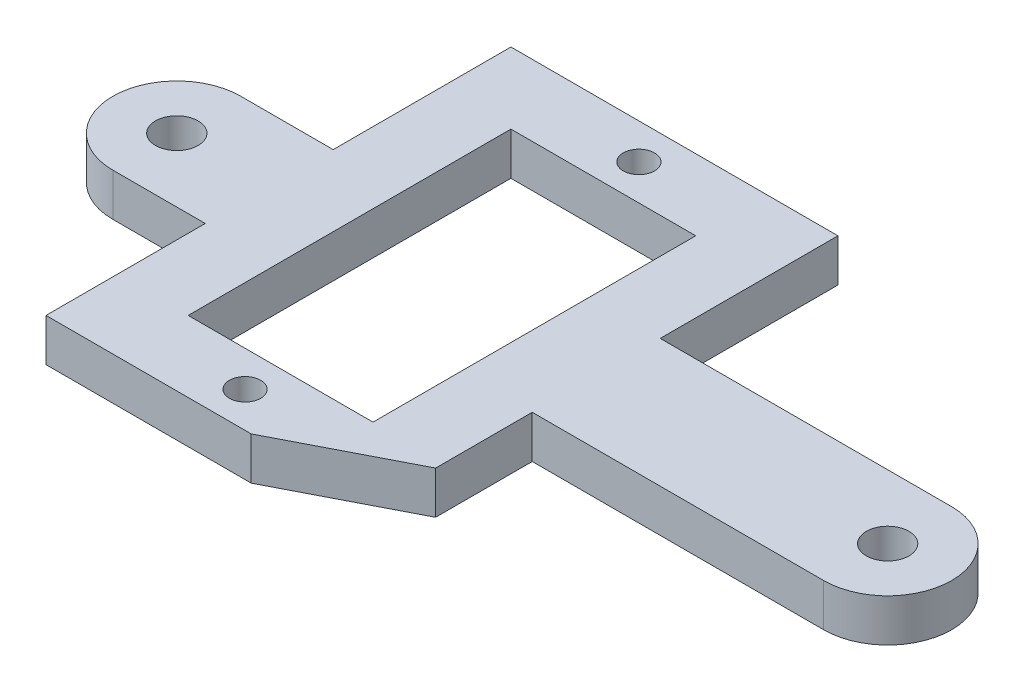
ISO-10303-21;
HEADER;
FILE_DESCRIPTION(('STEP AP214'),'2;1');
FILE_NAME('part.step','',(''),(''),'','','');
FILE_SCHEMA(('AUTOMOTIVE_DESIGN { 1 0 10303 214 1 1 1 1 }'));
ENDSEC;
DATA;
#1=APPLICATION_CONTEXT('core data for automotive mechanical design processes');
#2=APPLICATION_PROTOCOL_DEFINITION('international standard','automotive_design',2000,#1);
#3=PRODUCT_CONTEXT('',#1,'mechanical');
#4=PRODUCT('Part','Part','',(#3));
#5=PRODUCT_RELATED_PRODUCT_CATEGORY('part','',(#4));
#6=PRODUCT_DEFINITION_FORMATION('','',#4);
#7=PRODUCT_DEFINITION_CONTEXT('part definition',#1,'design');
#8=PRODUCT_DEFINITION('design','',#6,#7);
#9=PRODUCT_DEFINITION_SHAPE('','',#8);
#10=(LENGTH_UNIT() NAMED_UNIT(*) SI_UNIT(.MILLI.,.METRE.));
#11=(NAMED_UNIT(*) PLANE_ANGLE_UNIT() SI_UNIT($,.RADIAN.));
#12=(NAMED_UNIT(*) SI_UNIT($,.STERADIAN.) SOLID_ANGLE_UNIT());
#13=UNCERTAINTY_MEASURE_WITH_UNIT(LENGTH_MEASURE(1.E-05),#10,'distance_accuracy_value','');
#14=(GEOMETRIC_REPRESENTATION_CONTEXT(3) GLOBAL_UNCERTAINTY_ASSIGNED_CONTEXT((#13)) GLOBAL_UNIT_ASSIGNED_CONTEXT((#10,
#11,#12)) REPRESENTATION_CONTEXT('',''));
#15=CARTESIAN_POINT('',(0.,0.,0.));
#16=DIRECTION('',(0.,0.,1.));
#17=DIRECTION('',(1.,0.,0.));
#18=AXIS2_PLACEMENT_3D('',#15,#16,#17);
#19=CARTESIAN_POINT('',(-25.,3.,0.));
#20=DIRECTION('',(0.,-1.,0.));
#21=DIRECTION('',(0.,0.,-1.));
#22=AXIS2_PLACEMENT_3D('',#19,#20,#21);
#23=CYLINDRICAL_SURFACE('',#22,4.5);
#24=CARTESIAN_POINT('',(-25.,0.,0.));
#25=DIRECTION('',(0.,1.,0.));
#26=DIRECTION('',(0.,0.,1.));
#27=AXIS2_PLACEMENT_3D('',#24,#25,#26);
#28=CIRCLE('',#27,4.5);
#29=CARTESIAN_POINT('',(-25.,0.,-4.5));
#30=VERTEX_POINT('',#29);
#31=CARTESIAN_POINT('',(-25.,0.,4.5));
#32=VERTEX_POINT('',#31);
#33=EDGE_CURVE('E223',#30,#32,#28,.T.);
#34=ORIENTED_EDGE('',*,*,#33,.T.);
#35=DIRECTION('',(0.,-1.,0.));
#36=VECTOR('',#35,1.);
#37=CARTESIAN_POINT('',(-25.,3.,4.5));
#38=LINE('',#37,#36);
#39=CARTESIAN_POINT('',(-25.,3.,4.5));
#40=VERTEX_POINT('',#39);
#41=EDGE_CURVE('E11',#40,#32,#38,.T.);
#42=ORIENTED_EDGE('',*,*,#41,.F.);
#43=CARTESIAN_POINT('',(-25.,3.,0.));
#44=DIRECTION('',(0.,1.,0.));
#45=DIRECTION('',(0.,0.,1.));
#46=AXIS2_PLACEMENT_3D('',#43,#44,#45);
#47=CIRCLE('',#46,4.5);
#48=CARTESIAN_POINT('',(-25.,3.,-4.5));
#49=VERTEX_POINT('',#48);
#50=EDGE_CURVE('E409',#49,#40,#47,.T.);
#51=ORIENTED_EDGE('',*,*,#50,.F.);
#52=DIRECTION('',(0.,-1.,0.));
#53=VECTOR('',#52,1.);
#54=CARTESIAN_POINT('',(-25.,3.,-4.5));
#55=LINE('',#54,#53);
#56=EDGE_CURVE('E69',#49,#30,#55,.T.);
#57=ORIENTED_EDGE('',*,*,#56,.T.);
#58=EDGE_LOOP('',(#34,#42,#51,#57));
#59=FACE_BOUND('',#58,.T.);
#60=ADVANCED_FACE('F43',(#59),#23,.T.);
#61=CARTESIAN_POINT('',(0.,3.,4.5));
#62=DIRECTION('',(0.,0.,1.));
#63=DIRECTION('',(1.,0.,0.));
#64=AXIS2_PLACEMENT_3D('',#61,#62,#63);
#65=PLANE('',#64);
#66=DIRECTION('',(-1.,0.,0.));
#67=VECTOR('',#66,1.);
#68=CARTESIAN_POINT('',(0.,0.,4.5));
#69=LINE('',#68,#67);
#70=CARTESIAN_POINT('',(-18.5,0.,4.5));
#71=VERTEX_POINT('',#70);
#72=EDGE_CURVE('E225',#71,#32,#69,.T.);
#73=ORIENTED_EDGE('',*,*,#72,.F.);
#74=DIRECTION('',(0.,-1.,0.));
#75=VECTOR('',#74,1.);
#76=CARTESIAN_POINT('',(-18.5,3.,4.5));
#77=LINE('',#76,#75);
#78=CARTESIAN_POINT('',(-18.5,3.,4.5));
#79=VERTEX_POINT('',#78);
#80=EDGE_CURVE('E52',#79,#71,#77,.T.);
#81=ORIENTED_EDGE('',*,*,#80,.F.);
#82=DIRECTION('',(-1.,0.,0.));
#83=VECTOR('',#82,1.);
#84=CARTESIAN_POINT('',(0.,3.,4.5));
#85=LINE('',#84,#83);
#86=EDGE_CURVE('E396',#79,#40,#85,.T.);
#87=ORIENTED_EDGE('',*,*,#86,.T.);
#88=ORIENTED_EDGE('',*,*,#41,.T.);
#89=EDGE_LOOP('',(#73,#81,#87,#88));
#90=FACE_BOUND('',#89,.T.);
#91=ADVANCED_FACE('F315',(#90),#65,.T.);
#92=CARTESIAN_POINT('',(-18.5,3.,0.));
#93=DIRECTION('',(-1.,0.,0.));
#94=DIRECTION('',(0.,0.,1.));
#95=AXIS2_PLACEMENT_3D('',#92,#93,#94);
#96=PLANE('',#95);
#97=DIRECTION('',(0.,0.,-1.));
#98=VECTOR('',#97,1.);
#99=CARTESIAN_POINT('',(-18.5,0.,0.));
#100=LINE('',#99,#98);
#101=CARTESIAN_POINT('',(-18.5,0.,15.7));
#102=VERTEX_POINT('',#101);
#103=EDGE_CURVE('E228',#102,#71,#100,.T.);
#104=ORIENTED_EDGE('',*,*,#103,.F.);
#105=DIRECTION('',(0.,-1.,0.));
#106=VECTOR('',#105,1.);
#107=CARTESIAN_POINT('',(-18.5,3.,15.7));
#108=LINE('',#107,#106);
#109=CARTESIAN_POINT('',(-18.5,3.,15.7));
#110=VERTEX_POINT('',#109);
#111=EDGE_CURVE('E275',#110,#102,#108,.T.);
#112=ORIENTED_EDGE('',*,*,#111,.F.);
#113=DIRECTION('',(0.,0.,-1.));
#114=VECTOR('',#113,1.);
#115=CARTESIAN_POINT('',(-18.5,3.,0.));
#116=LINE('',#115,#114);
#117=EDGE_CURVE('E392',#110,#79,#116,.T.);
#118=ORIENTED_EDGE('',*,*,#117,.T.);
#119=ORIENTED_EDGE('',*,*,#80,.T.);
#120=EDGE_LOOP('',(#104,#112,#118,#119));
#121=FACE_BOUND('',#120,.T.);
#122=ADVANCED_FACE('F320',(#121),#96,.T.);
#123=CARTESIAN_POINT('',(0.,3.,15.7));
#124=DIRECTION('',(0.,0.,1.));
#125=DIRECTION('',(1.,0.,0.));
#126=AXIS2_PLACEMENT_3D('',#123,#124,#125);
#127=PLANE('',#126);
#128=DIRECTION('',(0.,1.,0.));
#129=VECTOR('',#128,1.);
#130=CARTESIAN_POINT('',(-4.06496436339705,0.,15.7));
#131=LINE('',#130,#129);
#132=CARTESIAN_POINT('',(-4.06496436339704,0.,15.7));
#133=VERTEX_POINT('',#132);
#134=CARTESIAN_POINT('',(-4.06496436339705,3.,15.7));
#135=VERTEX_POINT('',#134);
#136=EDGE_CURVE('E60',#133,#135,#131,.T.);
#137=ORIENTED_EDGE('',*,*,#136,.T.);
#138=DIRECTION('',(-1.,0.,0.));
#139=VECTOR('',#138,1.);
#140=CARTESIAN_POINT('',(0.,3.,15.7));
#141=LINE('',#140,#139);
#142=EDGE_CURVE('E390',#135,#110,#141,.T.);
#143=ORIENTED_EDGE('',*,*,#142,.T.);
#144=ORIENTED_EDGE('',*,*,#111,.T.);
#145=DIRECTION('',(-1.,0.,0.));
#146=VECTOR('',#145,1.);
#147=CARTESIAN_POINT('',(0.,0.,15.7));
#148=LINE('',#147,#146);
#149=EDGE_CURVE('E231',#133,#102,#148,.T.);
#150=ORIENTED_EDGE('',*,*,#149,.F.);
#151=EDGE_LOOP('',(#137,#143,#144,#150));
#152=FACE_BOUND('',#151,.T.);
#153=ADVANCED_FACE('F371',(#152),#127,.T.);
#154=CARTESIAN_POINT('',(4.49999999999999,3.,0.));
#155=DIRECTION('',(-1.,0.,0.));
#156=DIRECTION('',(0.,0.,1.));
#157=AXIS2_PLACEMENT_3D('',#154,#155,#156);
#158=PLANE('',#157);
#159=DIRECTION('',(0.,0.,-1.));
#160=VECTOR('',#159,1.);
#161=CARTESIAN_POINT('',(4.49999999999999,3.,0.));
#162=LINE('',#161,#160);
#163=CARTESIAN_POINT('',(4.5,3.,11.2960154737872));
#164=VERTEX_POINT('',#163);
#165=CARTESIAN_POINT('',(4.5,3.,4.5));
#166=VERTEX_POINT('',#165);
#167=EDGE_CURVE('E391',#164,#166,#162,.T.);
#168=ORIENTED_EDGE('',*,*,#167,.F.);
#169=DIRECTION('',(0.,1.,0.));
#170=VECTOR('',#169,1.);
#171=CARTESIAN_POINT('',(4.5,0.,11.2960154737872));
#172=LINE('',#171,#170);
#173=CARTESIAN_POINT('',(4.5,0.,11.2960154737872));
#174=VERTEX_POINT('',#173);
#175=EDGE_CURVE('E422',#174,#164,#172,.T.);
#176=ORIENTED_EDGE('',*,*,#175,.F.);
#177=DIRECTION('',(0.,0.,-1.));
#178=VECTOR('',#177,1.);
#179=CARTESIAN_POINT('',(4.49999999999999,0.,0.));
#180=LINE('',#179,#178);
#181=CARTESIAN_POINT('',(4.5,0.,4.5));
#182=VERTEX_POINT('',#181);
#183=EDGE_CURVE('E233',#174,#182,#180,.T.);
#184=ORIENTED_EDGE('',*,*,#183,.T.);
#185=DIRECTION('',(0.,-1.,0.));
#186=VECTOR('',#185,1.);
#187=CARTESIAN_POINT('',(4.5,3.,4.5));
#188=LINE('',#187,#186);
#189=EDGE_CURVE('E272',#166,#182,#188,.T.);
#190=ORIENTED_EDGE('',*,*,#189,.F.);
#191=EDGE_LOOP('',(#168,#176,#184,#190));
#192=FACE_BOUND('',#191,.T.);
#193=ADVANCED_FACE('F367',(#192),#158,.F.);
#194=CARTESIAN_POINT('',(0.,3.,4.5));
#195=DIRECTION('',(0.,0.,1.));
#196=DIRECTION('',(1.,0.,0.));
#197=AXIS2_PLACEMENT_3D('',#194,#195,#196);
#198=PLANE('',#197);
#199=DIRECTION('',(-1.,0.,0.));
#200=VECTOR('',#199,1.);
#201=CARTESIAN_POINT('',(0.,0.,4.5));
#202=LINE('',#201,#200);
#203=CARTESIAN_POINT('',(25.,0.,4.5));
#204=VERTEX_POINT('',#203);
#205=EDGE_CURVE('E235',#204,#182,#202,.T.);
#206=ORIENTED_EDGE('',*,*,#205,.F.);
#207=DIRECTION('',(0.,-1.,0.));
#208=VECTOR('',#207,1.);
#209=CARTESIAN_POINT('',(25.,3.,4.5));
#210=LINE('',#209,#208);
#211=CARTESIAN_POINT('',(25.,3.,4.5));
#212=VERTEX_POINT('',#211);
#213=EDGE_CURVE('E270',#212,#204,#210,.T.);
#214=ORIENTED_EDGE('',*,*,#213,.F.);
#215=DIRECTION('',(-1.,0.,0.));
#216=VECTOR('',#215,1.);
#217=CARTESIAN_POINT('',(0.,3.,4.5));
#218=LINE('',#217,#216);
#219=EDGE_CURVE('E394',#212,#166,#218,.T.);
#220=ORIENTED_EDGE('',*,*,#219,.T.);
#221=ORIENTED_EDGE('',*,*,#189,.T.);
#222=EDGE_LOOP('',(#206,#214,#220,#221));
#223=FACE_BOUND('',#222,.T.);
#224=ADVANCED_FACE('F363',(#223),#198,.T.);
#225=CARTESIAN_POINT('',(25.,3.,0.));
#226=DIRECTION('',(0.,-1.,0.));
#227=DIRECTION('',(0.,0.,-1.));
#228=AXIS2_PLACEMENT_3D('',#225,#226,#227);
#229=CYLINDRICAL_SURFACE('',#228,4.5);
#230=CARTESIAN_POINT('',(25.,0.,0.));
#231=DIRECTION('',(0.,1.,0.));
#232=DIRECTION('',(0.,0.,1.));
#233=AXIS2_PLACEMENT_3D('',#230,#231,#232);
#234=CIRCLE('',#233,4.5);
#235=CARTESIAN_POINT('',(25.,0.,-4.5));
#236=VERTEX_POINT('',#235);
#237=EDGE_CURVE('E238',#204,#236,#234,.T.);
#238=ORIENTED_EDGE('',*,*,#237,.T.);
#239=DIRECTION('',(0.,-1.,0.));
#240=VECTOR('',#239,1.);
#241=CARTESIAN_POINT('',(25.,3.,-4.5));
#242=LINE('',#241,#240);
#243=CARTESIAN_POINT('',(25.,3.,-4.5));
#244=VERTEX_POINT('',#243);
#245=EDGE_CURVE('E268',#244,#236,#242,.T.);
#246=ORIENTED_EDGE('',*,*,#245,.F.);
#247=CARTESIAN_POINT('',(25.,3.,0.));
#248=DIRECTION('',(0.,1.,0.));
#249=DIRECTION('',(0.,0.,1.));
#250=AXIS2_PLACEMENT_3D('',#247,#248,#249);
#251=CIRCLE('',#250,4.5);
#252=EDGE_CURVE('E402',#212,#244,#251,.T.);
#253=ORIENTED_EDGE('',*,*,#252,.F.);
#254=ORIENTED_EDGE('',*,*,#213,.T.);
#255=EDGE_LOOP('',(#238,#246,#253,#254));
#256=FACE_BOUND('',#255,.T.);
#257=ADVANCED_FACE('F359',(#256),#229,.T.);
#258=CARTESIAN_POINT('',(0.,3.,-4.5));
#259=DIRECTION('',(0.,0.,-1.));
#260=DIRECTION('',(-1.,0.,0.));
#261=AXIS2_PLACEMENT_3D('',#258,#259,#260);
#262=PLANE('',#261);
#263=DIRECTION('',(1.,0.,0.));
#264=VECTOR('',#263,1.);
#265=CARTESIAN_POINT('',(0.,0.,-4.5));
#266=LINE('',#265,#264);
#267=CARTESIAN_POINT('',(4.49999999999999,0.,-4.5));
#268=VERTEX_POINT('',#267);
#269=EDGE_CURVE('E241',#268,#236,#266,.T.);
#270=ORIENTED_EDGE('',*,*,#269,.F.);
#271=DIRECTION('',(0.,-1.,0.));
#272=VECTOR('',#271,1.);
#273=CARTESIAN_POINT('',(4.49999999999999,3.,-4.5));
#274=LINE('',#273,#272);
#275=CARTESIAN_POINT('',(4.49999999999999,3.,-4.5));
#276=VERTEX_POINT('',#275);
#277=EDGE_CURVE('E266',#276,#268,#274,.T.);
#278=ORIENTED_EDGE('',*,*,#277,.F.);
#279=DIRECTION('',(1.,0.,0.));
#280=VECTOR('',#279,1.);
#281=CARTESIAN_POINT('',(0.,3.,-4.5));
#282=LINE('',#281,#280);
#283=EDGE_CURVE('E404',#276,#244,#282,.T.);
#284=ORIENTED_EDGE('',*,*,#283,.T.);
#285=ORIENTED_EDGE('',*,*,#245,.T.);
#286=EDGE_LOOP('',(#270,#278,#284,#285));
#287=FACE_BOUND('',#286,.T.);
#288=ADVANCED_FACE('F355',(#287),#262,.T.);
#289=CARTESIAN_POINT('',(4.49999999999999,3.,0.));
#290=DIRECTION('',(1.,0.,0.));
#291=DIRECTION('',(0.,0.,-1.));
#292=AXIS2_PLACEMENT_3D('',#289,#290,#291);
#293=PLANE('',#292);
#294=DIRECTION('',(0.,0.,1.));
#295=VECTOR('',#294,1.);
#296=CARTESIAN_POINT('',(4.49999999999999,0.,0.));
#297=LINE('',#296,#295);
#298=CARTESIAN_POINT('',(4.49999999999999,0.,-17.));
#299=VERTEX_POINT('',#298);
#300=EDGE_CURVE('E244',#299,#268,#297,.T.);
#301=ORIENTED_EDGE('',*,*,#300,.F.);
#302=DIRECTION('',(0.,-1.,0.));
#303=VECTOR('',#302,1.);
#304=CARTESIAN_POINT('',(4.49999999999999,3.,-17.));
#305=LINE('',#304,#303);
#306=CARTESIAN_POINT('',(4.49999999999999,3.,-17.));
#307=VERTEX_POINT('',#306);
#308=EDGE_CURVE('E190',#307,#299,#305,.T.);
#309=ORIENTED_EDGE('',*,*,#308,.F.);
#310=DIRECTION('',(0.,0.,1.));
#311=VECTOR('',#310,1.);
#312=CARTESIAN_POINT('',(4.49999999999999,3.,0.));
#313=LINE('',#312,#311);
#314=EDGE_CURVE('E179',#307,#276,#313,.T.);
#315=ORIENTED_EDGE('',*,*,#314,.T.);
#316=ORIENTED_EDGE('',*,*,#277,.T.);
#317=EDGE_LOOP('',(#301,#309,#315,#316));
#318=FACE_BOUND('',#317,.T.);
#319=ADVANCED_FACE('F352',(#318),#293,.T.);
#320=CARTESIAN_POINT('',(0.,3.,-17.));
#321=DIRECTION('',(0.,0.,1.));
#322=DIRECTION('',(1.,0.,0.));
#323=AXIS2_PLACEMENT_3D('',#320,#321,#322);
#324=PLANE('',#323);
#325=DIRECTION('',(-1.,0.,0.));
#326=VECTOR('',#325,1.);
#327=CARTESIAN_POINT('',(0.,0.,-17.));
#328=LINE('',#327,#326);
#329=CARTESIAN_POINT('',(-18.5,0.,-17.));
#330=VERTEX_POINT('',#329);
#331=EDGE_CURVE('E186',#299,#330,#328,.T.);
#332=ORIENTED_EDGE('',*,*,#331,.T.);
#333=DIRECTION('',(0.,-1.,0.));
#334=VECTOR('',#333,1.);
#335=CARTESIAN_POINT('',(-18.5,3.,-17.));
#336=LINE('',#335,#334);
#337=CARTESIAN_POINT('',(-18.5,3.,-17.));
#338=VERTEX_POINT('',#337);
#339=EDGE_CURVE('E183',#338,#330,#336,.T.);
#340=ORIENTED_EDGE('',*,*,#339,.F.);
#341=DIRECTION('',(-1.,0.,0.));
#342=VECTOR('',#341,1.);
#343=CARTESIAN_POINT('',(0.,3.,-17.));
#344=LINE('',#343,#342);
#345=EDGE_CURVE('E168',#307,#338,#344,.T.);
#346=ORIENTED_EDGE('',*,*,#345,.F.);
#347=ORIENTED_EDGE('',*,*,#308,.T.);
#348=EDGE_LOOP('',(#332,#340,#346,#347));
#349=FACE_BOUND('',#348,.T.);
#350=ADVANCED_FACE('F184',(#349),#324,.F.);
#351=CARTESIAN_POINT('',(-18.5,3.,0.));
#352=DIRECTION('',(1.,0.,0.));
#353=DIRECTION('',(0.,0.,-1.));
#354=AXIS2_PLACEMENT_3D('',#351,#352,#353);
#355=PLANE('',#354);
#356=DIRECTION('',(0.,0.,1.));
#357=VECTOR('',#356,1.);
#358=CARTESIAN_POINT('',(-18.5,0.,0.));
#359=LINE('',#358,#357);
#360=CARTESIAN_POINT('',(-18.5,0.,-4.5));
#361=VERTEX_POINT('',#360);
#362=EDGE_CURVE('E248',#330,#361,#359,.T.);
#363=ORIENTED_EDGE('',*,*,#362,.T.);
#364=DIRECTION('',(0.,-1.,0.));
#365=VECTOR('',#364,1.);
#366=CARTESIAN_POINT('',(-18.5,3.,-4.5));
#367=LINE('',#366,#365);
#368=CARTESIAN_POINT('',(-18.5,3.,-4.5));
#369=VERTEX_POINT('',#368);
#370=EDGE_CURVE('E191',#369,#361,#367,.T.);
#371=ORIENTED_EDGE('',*,*,#370,.F.);
#372=DIRECTION('',(0.,0.,1.));
#373=VECTOR('',#372,1.);
#374=CARTESIAN_POINT('',(-18.5,3.,0.));
#375=LINE('',#374,#373);
#376=EDGE_CURVE('E175',#338,#369,#375,.T.);
#377=ORIENTED_EDGE('',*,*,#376,.F.);
#378=ORIENTED_EDGE('',*,*,#339,.T.);
#379=EDGE_LOOP('',(#363,#371,#377,#378));
#380=FACE_BOUND('',#379,.T.);
#381=ADVANCED_FACE('F193',(#380),#355,.F.);
#382=CARTESIAN_POINT('',(-0.5,3.,0.));
#383=DIRECTION('',(-1.,0.,0.));
#384=DIRECTION('',(0.,0.,1.));
#385=AXIS2_PLACEMENT_3D('',#382,#383,#384);
#386=PLANE('',#385);
#387=DIRECTION('',(0.,0.,-1.));
#388=VECTOR('',#387,1.);
#389=CARTESIAN_POINT('',(-0.5,0.,0.));
#390=LINE('',#389,#388);
#391=CARTESIAN_POINT('',(-0.5,0.,10.7));
#392=VERTEX_POINT('',#391);
#393=CARTESIAN_POINT('',(-0.5,0.,-12.));
#394=VERTEX_POINT('',#393);
#395=EDGE_CURVE('E209',#392,#394,#390,.T.);
#396=ORIENTED_EDGE('',*,*,#395,.F.);
#397=DIRECTION('',(0.,-1.,0.));
#398=VECTOR('',#397,1.);
#399=CARTESIAN_POINT('',(-0.5,3.,10.7));
#400=LINE('',#399,#398);
#401=CARTESIAN_POINT('',(-0.5,3.,10.7));
#402=VERTEX_POINT('',#401);
#403=EDGE_CURVE('E47',#402,#392,#400,.T.);
#404=ORIENTED_EDGE('',*,*,#403,.F.);
#405=DIRECTION('',(0.,0.,-1.));
#406=VECTOR('',#405,1.);
#407=CARTESIAN_POINT('',(-0.5,3.,0.));
#408=LINE('',#407,#406);
#409=CARTESIAN_POINT('',(-0.5,3.,-12.));
#410=VERTEX_POINT('',#409);
#411=EDGE_CURVE('E262',#402,#410,#408,.T.);
#412=ORIENTED_EDGE('',*,*,#411,.T.);
#413=DIRECTION('',(0.,-1.,0.));
#414=VECTOR('',#413,1.);
#415=CARTESIAN_POINT('',(-0.5,3.,-12.));
#416=LINE('',#415,#414);
#417=EDGE_CURVE('E208',#410,#394,#416,.T.);
#418=ORIENTED_EDGE('',*,*,#417,.T.);
#419=EDGE_LOOP('',(#396,#404,#412,#418));
#420=FACE_BOUND('',#419,.T.);
#421=ADVANCED_FACE('F45',(#420),#386,.T.);
#422=CARTESIAN_POINT('',(0.,3.,10.7));
#423=DIRECTION('',(0.,0.,1.));
#424=DIRECTION('',(1.,0.,0.));
#425=AXIS2_PLACEMENT_3D('',#422,#423,#424);
#426=PLANE('',#425);
#427=DIRECTION('',(-1.,0.,0.));
#428=VECTOR('',#427,1.);
#429=CARTESIAN_POINT('',(0.,0.,10.7));
#430=LINE('',#429,#428);
#431=CARTESIAN_POINT('',(-13.5,0.,10.7));
#432=VERTEX_POINT('',#431);
#433=EDGE_CURVE('E212',#392,#432,#430,.T.);
#434=ORIENTED_EDGE('',*,*,#433,.T.);
#435=DIRECTION('',(0.,-1.,0.));
#436=VECTOR('',#435,1.);
#437=CARTESIAN_POINT('',(-13.5,3.,10.7));
#438=LINE('',#437,#436);
#439=CARTESIAN_POINT('',(-13.5,3.,10.7));
#440=VERTEX_POINT('',#439);
#441=EDGE_CURVE('E281',#440,#432,#438,.T.);
#442=ORIENTED_EDGE('',*,*,#441,.F.);
#443=DIRECTION('',(-1.,0.,0.));
#444=VECTOR('',#443,1.);
#445=CARTESIAN_POINT('',(0.,3.,10.7));
#446=LINE('',#445,#444);
#447=EDGE_CURVE('E290',#402,#440,#446,.T.);
#448=ORIENTED_EDGE('',*,*,#447,.F.);
#449=ORIENTED_EDGE('',*,*,#403,.T.);
#450=EDGE_LOOP('',(#434,#442,#448,#449));
#451=FACE_BOUND('',#450,.T.);
#452=ADVANCED_FACE('F289',(#451),#426,.F.);
#453=CARTESIAN_POINT('',(-13.5,3.,0.));
#454=DIRECTION('',(-1.,0.,0.));
#455=DIRECTION('',(0.,0.,1.));
#456=AXIS2_PLACEMENT_3D('',#453,#454,#455);
#457=PLANE('',#456);
#458=DIRECTION('',(0.,0.,-1.));
#459=VECTOR('',#458,1.);
#460=CARTESIAN_POINT('',(-13.5,0.,0.));
#461=LINE('',#460,#459);
#462=CARTESIAN_POINT('',(-13.5,0.,-12.));
#463=VERTEX_POINT('',#462);
#464=EDGE_CURVE('E214',#432,#463,#461,.T.);
#465=ORIENTED_EDGE('',*,*,#464,.T.);
#466=DIRECTION('',(0.,-1.,0.));
#467=VECTOR('',#466,1.);
#468=CARTESIAN_POINT('',(-13.5,3.,-12.));
#469=LINE('',#468,#467);
#470=CARTESIAN_POINT('',(-13.5,3.,-12.));
#471=VERTEX_POINT('',#470);
#472=EDGE_CURVE('E280',#471,#463,#469,.T.);
#473=ORIENTED_EDGE('',*,*,#472,.F.);
#474=DIRECTION('',(0.,0.,-1.));
#475=VECTOR('',#474,1.);
#476=CARTESIAN_POINT('',(-13.5,3.,0.));
#477=LINE('',#476,#475);
#478=EDGE_CURVE('E418',#440,#471,#477,.T.);
#479=ORIENTED_EDGE('',*,*,#478,.F.);
#480=ORIENTED_EDGE('',*,*,#441,.T.);
#481=EDGE_LOOP('',(#465,#473,#479,#480));
#482=FACE_BOUND('',#481,.T.);
#483=ADVANCED_FACE('F302',(#482),#457,.F.);
#484=CARTESIAN_POINT('',(-7.,3.,13.2));
#485=DIRECTION('',(0.,-1.,0.));
#486=DIRECTION('',(0.,0.,-1.));
#487=AXIS2_PLACEMENT_3D('',#484,#485,#486);
#488=CYLINDRICAL_SURFACE('',#487,1.1);
#489=CARTESIAN_POINT('',(-7.,3.,13.2));
#490=DIRECTION('',(0.,1.,0.));
#491=DIRECTION('',(0.,0.,1.));
#492=AXIS2_PLACEMENT_3D('',#489,#490,#491);
#493=CIRCLE('',#492,1.1);
#494=CARTESIAN_POINT('',(-7.,3.,14.3));
#495=VERTEX_POINT('',#494);
#496=EDGE_CURVE('E202',#495,#495,#493,.T.);
#497=ORIENTED_EDGE('',*,*,#496,.T.);
#498=EDGE_LOOP('',(#497));
#499=FACE_BOUND('',#498,.T.);
#500=CARTESIAN_POINT('',(-7.,0.,13.2));
#501=DIRECTION('',(0.,1.,0.));
#502=DIRECTION('',(0.,0.,1.));
#503=AXIS2_PLACEMENT_3D('',#500,#501,#502);
#504=CIRCLE('',#503,1.1);
#505=CARTESIAN_POINT('',(-7.,0.,14.3));
#506=VERTEX_POINT('',#505);
#507=EDGE_CURVE('E256',#506,#506,#504,.T.);
#508=ORIENTED_EDGE('',*,*,#507,.F.);
#509=EDGE_LOOP('',(#508));
#510=FACE_BOUND('',#509,.T.);
#511=ADVANCED_FACE('F304',(#499,#510),#488,.F.);
#512=CARTESIAN_POINT('',(-7.,3.,-14.5));
#513=DIRECTION('',(0.,-1.,0.));
#514=DIRECTION('',(0.,0.,-1.));
#515=AXIS2_PLACEMENT_3D('',#512,#513,#514);
#516=CYLINDRICAL_SURFACE('',#515,1.1);
#517=CARTESIAN_POINT('',(-7.,3.,-14.5));
#518=DIRECTION('',(0.,1.,0.));
#519=DIRECTION('',(0.,0.,1.));
#520=AXIS2_PLACEMENT_3D('',#517,#518,#519);
#521=CIRCLE('',#520,1.1);
#522=CARTESIAN_POINT('',(-7.,3.,-13.4));
#523=VERTEX_POINT('',#522);
#524=EDGE_CURVE('E196',#523,#523,#521,.T.);
#525=ORIENTED_EDGE('',*,*,#524,.T.);
#526=EDGE_LOOP('',(#525));
#527=FACE_BOUND('',#526,.T.);
#528=CARTESIAN_POINT('',(-7.,0.,-14.5));
#529=DIRECTION('',(0.,1.,0.));
#530=DIRECTION('',(0.,0.,1.));
#531=AXIS2_PLACEMENT_3D('',#528,#529,#530);
#532=CIRCLE('',#531,1.1);
#533=CARTESIAN_POINT('',(-7.,0.,-13.4));
#534=VERTEX_POINT('',#533);
#535=EDGE_CURVE('E253',#534,#534,#532,.T.);
#536=ORIENTED_EDGE('',*,*,#535,.F.);
#537=EDGE_LOOP('',(#536));
#538=FACE_BOUND('',#537,.T.);
#539=ADVANCED_FACE('F310',(#527,#538),#516,.F.);
#540=CARTESIAN_POINT('',(0.,3.,-4.5));
#541=DIRECTION('',(0.,0.,-1.));
#542=DIRECTION('',(-1.,0.,0.));
#543=AXIS2_PLACEMENT_3D('',#540,#541,#542);
#544=PLANE('',#543);
#545=DIRECTION('',(1.,0.,0.));
#546=VECTOR('',#545,1.);
#547=CARTESIAN_POINT('',(0.,0.,-4.5));
#548=LINE('',#547,#546);
#549=EDGE_CURVE('E250',#30,#361,#548,.T.);
#550=ORIENTED_EDGE('',*,*,#549,.F.);
#551=ORIENTED_EDGE('',*,*,#56,.F.);
#552=DIRECTION('',(1.,0.,0.));
#553=VECTOR('',#552,1.);
#554=CARTESIAN_POINT('',(0.,3.,-4.5));
#555=LINE('',#554,#553);
#556=EDGE_CURVE('E194',#49,#369,#555,.T.);
#557=ORIENTED_EDGE('',*,*,#556,.T.);
#558=ORIENTED_EDGE('',*,*,#370,.T.);
#559=EDGE_LOOP('',(#550,#551,#557,#558));
#560=FACE_BOUND('',#559,.T.);
#561=ADVANCED_FACE('F327',(#560),#544,.T.);
#562=CARTESIAN_POINT('',(-25.,3.,0.));
#563=DIRECTION('',(0.,-1.,0.));
#564=DIRECTION('',(0.,0.,-1.));
#565=AXIS2_PLACEMENT_3D('',#562,#563,#564);
#566=CYLINDRICAL_SURFACE('',#565,1.5);
#567=CARTESIAN_POINT('',(-25.,3.,0.));
#568=DIRECTION('',(0.,1.,0.));
#569=DIRECTION('',(0.,0.,1.));
#570=AXIS2_PLACEMENT_3D('',#567,#568,#569);
#571=CIRCLE('',#570,1.5);
#572=CARTESIAN_POINT('',(-25.,3.,1.5));
#573=VERTEX_POINT('',#572);
#574=EDGE_CURVE('E412',#573,#573,#571,.T.);
#575=ORIENTED_EDGE('',*,*,#574,.T.);
#576=EDGE_LOOP('',(#575));
#577=FACE_BOUND('',#576,.T.);
#578=CARTESIAN_POINT('',(-25.,0.,0.));
#579=DIRECTION('',(0.,1.,0.));
#580=DIRECTION('',(0.,0.,1.));
#581=AXIS2_PLACEMENT_3D('',#578,#579,#580);
#582=CIRCLE('',#581,1.5);
#583=CARTESIAN_POINT('',(-25.,0.,1.5));
#584=VERTEX_POINT('',#583);
#585=EDGE_CURVE('E220',#584,#584,#582,.T.);
#586=ORIENTED_EDGE('',*,*,#585,.F.);
#587=EDGE_LOOP('',(#586));
#588=FACE_BOUND('',#587,.T.);
#589=ADVANCED_FACE('F325',(#577,#588),#566,.F.);
#590=CARTESIAN_POINT('',(0.,3.,-12.));
#591=DIRECTION('',(0.,0.,1.));
#592=DIRECTION('',(1.,0.,0.));
#593=AXIS2_PLACEMENT_3D('',#590,#591,#592);
#594=PLANE('',#593);
#595=DIRECTION('',(-1.,0.,0.));
#596=VECTOR('',#595,1.);
#597=CARTESIAN_POINT('',(0.,0.,-12.));
#598=LINE('',#597,#596);
#599=EDGE_CURVE('E217',#394,#463,#598,.T.);
#600=ORIENTED_EDGE('',*,*,#599,.F.);
#601=ORIENTED_EDGE('',*,*,#417,.F.);
#602=DIRECTION('',(-1.,0.,0.));
#603=VECTOR('',#602,1.);
#604=CARTESIAN_POINT('',(0.,3.,-12.));
#605=LINE('',#604,#603);
#606=EDGE_CURVE('E300',#410,#471,#605,.T.);
#607=ORIENTED_EDGE('',*,*,#606,.T.);
#608=ORIENTED_EDGE('',*,*,#472,.T.);
#609=EDGE_LOOP('',(#600,#601,#607,#608));
#610=FACE_BOUND('',#609,.T.);
#611=ADVANCED_FACE('F299',(#610),#594,.T.);
#612=CARTESIAN_POINT('',(25.,3.,0.));
#613=DIRECTION('',(0.,-1.,0.));
#614=DIRECTION('',(0.,0.,-1.));
#615=AXIS2_PLACEMENT_3D('',#612,#613,#614);
#616=CYLINDRICAL_SURFACE('',#615,1.5);
#617=CARTESIAN_POINT('',(25.,3.,0.));
#618=DIRECTION('',(0.,1.,0.));
#619=DIRECTION('',(0.,0.,1.));
#620=AXIS2_PLACEMENT_3D('',#617,#618,#619);
#621=CIRCLE('',#620,1.5);
#622=CARTESIAN_POINT('',(25.,3.,1.5));
#623=VERTEX_POINT('',#622);
#624=EDGE_CURVE('E205',#623,#623,#621,.T.);
#625=ORIENTED_EDGE('',*,*,#624,.T.);
#626=EDGE_LOOP('',(#625));
#627=FACE_BOUND('',#626,.T.);
#628=CARTESIAN_POINT('',(25.,0.,0.));
#629=DIRECTION('',(0.,1.,0.));
#630=DIRECTION('',(0.,0.,1.));
#631=AXIS2_PLACEMENT_3D('',#628,#629,#630);
#632=CIRCLE('',#631,1.5);
#633=CARTESIAN_POINT('',(25.,0.,1.5));
#634=VERTEX_POINT('',#633);
#635=EDGE_CURVE('E259',#634,#634,#632,.T.);
#636=ORIENTED_EDGE('',*,*,#635,.F.);
#637=EDGE_LOOP('',(#636));
#638=FACE_BOUND('',#637,.T.);
#639=ADVANCED_FACE('F330',(#627,#638),#616,.F.);
#640=CARTESIAN_POINT('',(0.,3.,0.));
#641=DIRECTION('',(0.,1.,0.));
#642=DIRECTION('',(0.,0.,1.));
#643=AXIS2_PLACEMENT_3D('',#640,#641,#642);
#644=PLANE('',#643);
#645=DIRECTION('',(-0.889323876389207,0.,0.457277861790919));
#646=VECTOR('',#645,1.);
#647=CARTESIAN_POINT('',(5.53469307636578,3.,10.7639908086096));
#648=LINE('',#647,#646);
#649=EDGE_CURVE('E426',#164,#135,#648,.T.);
#650=ORIENTED_EDGE('',*,*,#649,.F.);
#651=ORIENTED_EDGE('',*,*,#167,.T.);
#652=ORIENTED_EDGE('',*,*,#219,.F.);
#653=ORIENTED_EDGE('',*,*,#252,.T.);
#654=ORIENTED_EDGE('',*,*,#283,.F.);
#655=ORIENTED_EDGE('',*,*,#314,.F.);
#656=ORIENTED_EDGE('',*,*,#345,.T.);
#657=ORIENTED_EDGE('',*,*,#376,.T.);
#658=ORIENTED_EDGE('',*,*,#556,.F.);
#659=ORIENTED_EDGE('',*,*,#50,.T.);
#660=ORIENTED_EDGE('',*,*,#86,.F.);
#661=ORIENTED_EDGE('',*,*,#117,.F.);
#662=ORIENTED_EDGE('',*,*,#142,.F.);
#663=EDGE_LOOP('',(#650,#651,#652,#653,#654,#655,#656,#657,#658,#659,#660,#661,#662));
#664=FACE_BOUND('',#663,.T.);
#665=ORIENTED_EDGE('',*,*,#411,.F.);
#666=ORIENTED_EDGE('',*,*,#447,.T.);
#667=ORIENTED_EDGE('',*,*,#478,.T.);
#668=ORIENTED_EDGE('',*,*,#606,.F.);
#669=EDGE_LOOP('',(#665,#666,#667,#668));
#670=FACE_BOUND('',#669,.T.);
#671=ORIENTED_EDGE('',*,*,#574,.F.);
#672=EDGE_LOOP('',(#671));
#673=FACE_BOUND('',#672,.T.);
#674=ORIENTED_EDGE('',*,*,#524,.F.);
#675=EDGE_LOOP('',(#674));
#676=FACE_BOUND('',#675,.T.);
#677=ORIENTED_EDGE('',*,*,#496,.F.);
#678=EDGE_LOOP('',(#677));
#679=FACE_BOUND('',#678,.T.);
#680=ORIENTED_EDGE('',*,*,#624,.F.);
#681=EDGE_LOOP('',(#680));
#682=FACE_BOUND('',#681,.T.);
#683=ADVANCED_FACE('F171',(#664,#670,#673,#676,#679,#682),#644,.T.);
#684=CARTESIAN_POINT('',(0.,0.,0.));
#685=DIRECTION('',(0.,1.,0.));
#686=DIRECTION('',(0.,0.,1.));
#687=AXIS2_PLACEMENT_3D('',#684,#685,#686);
#688=PLANE('',#687);
#689=ORIENTED_EDGE('',*,*,#395,.T.);
#690=ORIENTED_EDGE('',*,*,#599,.T.);
#691=ORIENTED_EDGE('',*,*,#464,.F.);
#692=ORIENTED_EDGE('',*,*,#433,.F.);
#693=EDGE_LOOP('',(#689,#690,#691,#692));
#694=FACE_BOUND('',#693,.T.);
#695=ORIENTED_EDGE('',*,*,#585,.T.);
#696=EDGE_LOOP('',(#695));
#697=FACE_BOUND('',#696,.T.);
#698=ORIENTED_EDGE('',*,*,#183,.F.);
#699=DIRECTION('',(-0.889323876389207,0.,0.457277861790919));
#700=VECTOR('',#699,1.);
#701=CARTESIAN_POINT('',(5.53469307636578,0.,10.7639908086096));
#702=LINE('',#701,#700);
#703=EDGE_CURVE('E388',#174,#133,#702,.T.);
#704=ORIENTED_EDGE('',*,*,#703,.T.);
#705=ORIENTED_EDGE('',*,*,#149,.T.);
#706=ORIENTED_EDGE('',*,*,#103,.T.);
#707=ORIENTED_EDGE('',*,*,#72,.T.);
#708=ORIENTED_EDGE('',*,*,#33,.F.);
#709=ORIENTED_EDGE('',*,*,#549,.T.);
#710=ORIENTED_EDGE('',*,*,#362,.F.);
#711=ORIENTED_EDGE('',*,*,#331,.F.);
#712=ORIENTED_EDGE('',*,*,#300,.T.);
#713=ORIENTED_EDGE('',*,*,#269,.T.);
#714=ORIENTED_EDGE('',*,*,#237,.F.);
#715=ORIENTED_EDGE('',*,*,#205,.T.);
#716=EDGE_LOOP('',(#698,#704,#705,#706,#707,#708,#709,#710,#711,#712,#713,#714,#715));
#717=FACE_BOUND('',#716,.T.);
#718=ORIENTED_EDGE('',*,*,#535,.T.);
#719=EDGE_LOOP('',(#718));
#720=FACE_BOUND('',#719,.T.);
#721=ORIENTED_EDGE('',*,*,#507,.T.);
#722=EDGE_LOOP('',(#721));
#723=FACE_BOUND('',#722,.T.);
#724=ORIENTED_EDGE('',*,*,#635,.T.);
#725=EDGE_LOOP('',(#724));
#726=FACE_BOUND('',#725,.T.);
#727=ADVANCED_FACE('F293',(#694,#697,#717,#720,#723,#726),#688,.F.);
#728=CARTESIAN_POINT('',(5.53469307636578,0.,10.7639908086096));
#729=DIRECTION('',(-0.457277861790919,0.,-0.889323876389207));
#730=DIRECTION('',(-0.889323876389207,0.,0.457277861790919));
#731=AXIS2_PLACEMENT_3D('',#728,#729,#730);
#732=PLANE('',#731);
#733=ORIENTED_EDGE('',*,*,#649,.T.);
#734=ORIENTED_EDGE('',*,*,#136,.F.);
#735=ORIENTED_EDGE('',*,*,#703,.F.);
#736=ORIENTED_EDGE('',*,*,#175,.T.);
#737=EDGE_LOOP('',(#733,#734,#735,#736));
#738=FACE_BOUND('',#737,.T.);
#739=ADVANCED_FACE('F428',(#738),#732,.F.);
#740=CLOSED_SHELL('',(#60,#91,#122,#153,#193,#224,#257,#288,#319,#350,#381,#421,#452,#483,#511,
#539,#561,#589,#611,#639,#683,#727,#739));
#741=MANIFOLD_SOLID_BREP('B2',#740);
#742=ADVANCED_BREP_SHAPE_REPRESENTATION('',(#18,#741),#14);
#743=SHAPE_DEFINITION_REPRESENTATION(#9,#742);
ENDSEC;
END-ISO-10303-21;
